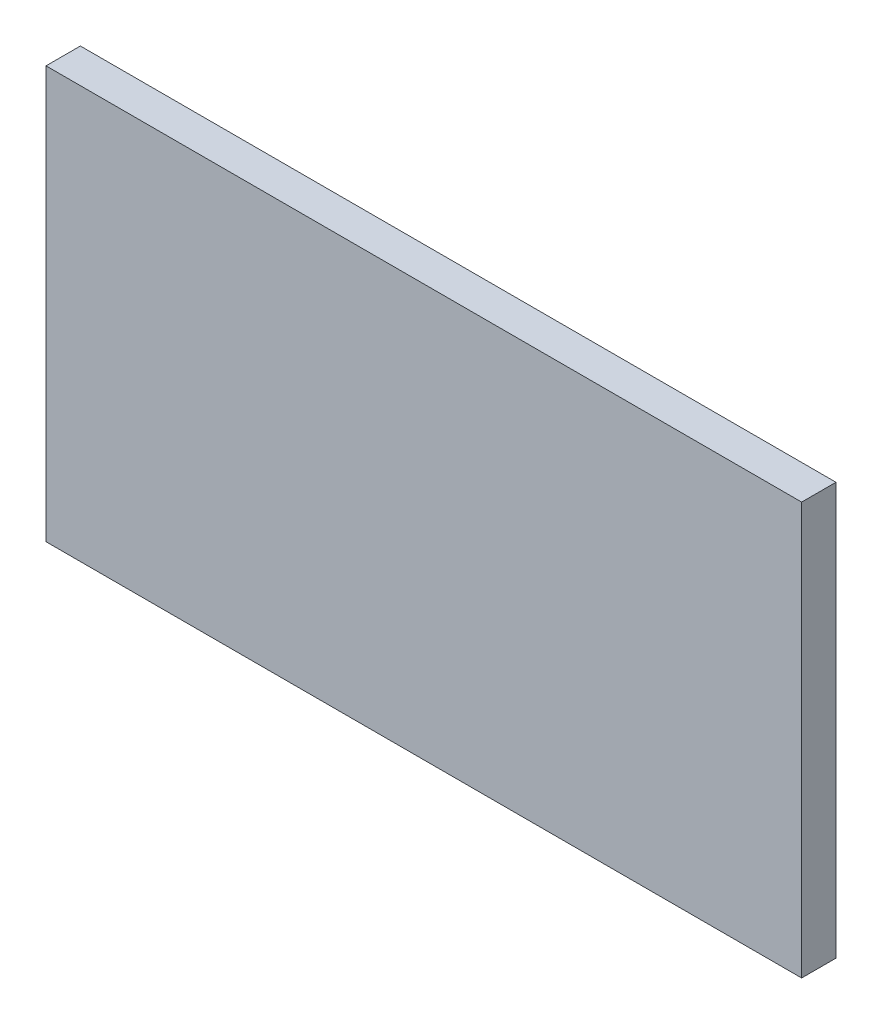
ISO-10303-21;
HEADER;
FILE_DESCRIPTION(('STEP AP214'),'2;1');
FILE_NAME('part.step','',(''),(''),'','','');
FILE_SCHEMA(('AUTOMOTIVE_DESIGN { 1 0 10303 214 1 1 1 1 }'));
ENDSEC;
DATA;
#1=APPLICATION_CONTEXT('core data for automotive mechanical design processes');
#2=APPLICATION_PROTOCOL_DEFINITION('international standard','automotive_design',2000,#1);
#3=PRODUCT_CONTEXT('',#1,'mechanical');
#4=PRODUCT('Part','Part','',(#3));
#5=PRODUCT_RELATED_PRODUCT_CATEGORY('part','',(#4));
#6=PRODUCT_DEFINITION_FORMATION('','',#4);
#7=PRODUCT_DEFINITION_CONTEXT('part definition',#1,'design');
#8=PRODUCT_DEFINITION('design','',#6,#7);
#9=PRODUCT_DEFINITION_SHAPE('','',#8);
#10=(LENGTH_UNIT() NAMED_UNIT(*) SI_UNIT(.MILLI.,.METRE.));
#11=(NAMED_UNIT(*) PLANE_ANGLE_UNIT() SI_UNIT($,.RADIAN.));
#12=(NAMED_UNIT(*) SI_UNIT($,.STERADIAN.) SOLID_ANGLE_UNIT());
#13=UNCERTAINTY_MEASURE_WITH_UNIT(LENGTH_MEASURE(1.E-05),#10,'distance_accuracy_value','');
#14=(GEOMETRIC_REPRESENTATION_CONTEXT(3) GLOBAL_UNCERTAINTY_ASSIGNED_CONTEXT((#13)) GLOBAL_UNIT_ASSIGNED_CONTEXT((#10,
#11,#12)) REPRESENTATION_CONTEXT('',''));
#15=CARTESIAN_POINT('',(0.,0.,0.));
#16=DIRECTION('',(0.,0.,1.));
#17=DIRECTION('',(1.,0.,0.));
#18=AXIS2_PLACEMENT_3D('',#15,#16,#17);
#19=CARTESIAN_POINT('',(55.,30.,5.));
#20=DIRECTION('',(-1.,0.,0.));
#21=DIRECTION('',(0.,-1.,0.));
#22=AXIS2_PLACEMENT_3D('',#19,#20,#21);
#23=PLANE('',#22);
#24=DIRECTION('',(0.,1.,0.));
#25=VECTOR('',#24,1.);
#26=CARTESIAN_POINT('',(55.,30.,0.));
#27=LINE('',#26,#25);
#28=CARTESIAN_POINT('',(55.,-30.,0.));
#29=VERTEX_POINT('',#28);
#30=CARTESIAN_POINT('',(55.,30.,0.));
#31=VERTEX_POINT('',#30);
#32=EDGE_CURVE('E107',#29,#31,#27,.T.);
#33=ORIENTED_EDGE('',*,*,#32,.T.);
#34=DIRECTION('',(0.,0.,-1.));
#35=VECTOR('',#34,1.);
#36=CARTESIAN_POINT('',(55.,30.,5.));
#37=LINE('',#36,#35);
#38=CARTESIAN_POINT('',(55.,30.,5.));
#39=VERTEX_POINT('',#38);
#40=EDGE_CURVE('E11',#39,#31,#37,.T.);
#41=ORIENTED_EDGE('',*,*,#40,.F.);
#42=DIRECTION('',(0.,1.,0.));
#43=VECTOR('',#42,1.);
#44=CARTESIAN_POINT('',(55.,30.,5.));
#45=LINE('',#44,#43);
#46=CARTESIAN_POINT('',(55.,-30.,5.));
#47=VERTEX_POINT('',#46);
#48=EDGE_CURVE('E91',#47,#39,#45,.T.);
#49=ORIENTED_EDGE('',*,*,#48,.F.);
#50=DIRECTION('',(0.,0.,-1.));
#51=VECTOR('',#50,1.);
#52=CARTESIAN_POINT('',(55.,-30.,5.));
#53=LINE('',#52,#51);
#54=EDGE_CURVE('E103',#47,#29,#53,.T.);
#55=ORIENTED_EDGE('',*,*,#54,.T.);
#56=EDGE_LOOP('',(#33,#41,#49,#55));
#57=FACE_BOUND('',#56,.T.);
#58=ADVANCED_FACE('F39',(#57),#23,.F.);
#59=CARTESIAN_POINT('',(-55.,30.,5.));
#60=DIRECTION('',(0.,-1.,0.));
#61=DIRECTION('',(0.,0.,-1.));
#62=AXIS2_PLACEMENT_3D('',#59,#60,#61);
#63=PLANE('',#62);
#64=DIRECTION('',(-1.,0.,0.));
#65=VECTOR('',#64,1.);
#66=CARTESIAN_POINT('',(-55.,30.,0.));
#67=LINE('',#66,#65);
#68=CARTESIAN_POINT('',(-55.,30.,0.));
#69=VERTEX_POINT('',#68);
#70=EDGE_CURVE('E96',#31,#69,#67,.T.);
#71=ORIENTED_EDGE('',*,*,#70,.T.);
#72=DIRECTION('',(0.,0.,-1.));
#73=VECTOR('',#72,1.);
#74=CARTESIAN_POINT('',(-55.,30.,5.));
#75=LINE('',#74,#73);
#76=CARTESIAN_POINT('',(-55.,30.,5.));
#77=VERTEX_POINT('',#76);
#78=EDGE_CURVE('E48',#77,#69,#75,.T.);
#79=ORIENTED_EDGE('',*,*,#78,.F.);
#80=DIRECTION('',(-1.,0.,0.));
#81=VECTOR('',#80,1.);
#82=CARTESIAN_POINT('',(-55.,30.,5.));
#83=LINE('',#82,#81);
#84=EDGE_CURVE('E86',#39,#77,#83,.T.);
#85=ORIENTED_EDGE('',*,*,#84,.F.);
#86=ORIENTED_EDGE('',*,*,#40,.T.);
#87=EDGE_LOOP('',(#71,#79,#85,#86));
#88=FACE_BOUND('',#87,.T.);
#89=ADVANCED_FACE('F95',(#88),#63,.F.);
#90=CARTESIAN_POINT('',(-55.,30.,5.));
#91=DIRECTION('',(1.,0.,0.));
#92=DIRECTION('',(0.,1.,0.));
#93=AXIS2_PLACEMENT_3D('',#90,#91,#92);
#94=PLANE('',#93);
#95=DIRECTION('',(0.,-1.,0.));
#96=VECTOR('',#95,1.);
#97=CARTESIAN_POINT('',(-55.,30.,0.));
#98=LINE('',#97,#96);
#99=CARTESIAN_POINT('',(-55.,-30.,0.));
#100=VERTEX_POINT('',#99);
#101=EDGE_CURVE('E73',#69,#100,#98,.T.);
#102=ORIENTED_EDGE('',*,*,#101,.T.);
#103=DIRECTION('',(0.,0.,-1.));
#104=VECTOR('',#103,1.);
#105=CARTESIAN_POINT('',(-55.,-30.,5.));
#106=LINE('',#105,#104);
#107=CARTESIAN_POINT('',(-55.,-30.,5.));
#108=VERTEX_POINT('',#107);
#109=EDGE_CURVE('E98',#108,#100,#106,.T.);
#110=ORIENTED_EDGE('',*,*,#109,.F.);
#111=DIRECTION('',(0.,-1.,0.));
#112=VECTOR('',#111,1.);
#113=CARTESIAN_POINT('',(-55.,30.,5.));
#114=LINE('',#113,#112);
#115=EDGE_CURVE('E89',#77,#108,#114,.T.);
#116=ORIENTED_EDGE('',*,*,#115,.F.);
#117=ORIENTED_EDGE('',*,*,#78,.T.);
#118=EDGE_LOOP('',(#102,#110,#116,#117));
#119=FACE_BOUND('',#118,.T.);
#120=ADVANCED_FACE('F99',(#119),#94,.F.);
#121=CARTESIAN_POINT('',(-55.,-30.,5.));
#122=DIRECTION('',(0.,1.,0.));
#123=DIRECTION('',(0.,0.,1.));
#124=AXIS2_PLACEMENT_3D('',#121,#122,#123);
#125=PLANE('',#124);
#126=DIRECTION('',(1.,0.,0.));
#127=VECTOR('',#126,1.);
#128=CARTESIAN_POINT('',(-55.,-30.,0.));
#129=LINE('',#128,#127);
#130=EDGE_CURVE('E79',#100,#29,#129,.T.);
#131=ORIENTED_EDGE('',*,*,#130,.T.);
#132=ORIENTED_EDGE('',*,*,#54,.F.);
#133=DIRECTION('',(1.,0.,0.));
#134=VECTOR('',#133,1.);
#135=CARTESIAN_POINT('',(-55.,-30.,5.));
#136=LINE('',#135,#134);
#137=EDGE_CURVE('E56',#108,#47,#136,.T.);
#138=ORIENTED_EDGE('',*,*,#137,.F.);
#139=ORIENTED_EDGE('',*,*,#109,.T.);
#140=EDGE_LOOP('',(#131,#132,#138,#139));
#141=FACE_BOUND('',#140,.T.);
#142=ADVANCED_FACE('F120',(#141),#125,.F.);
#143=CARTESIAN_POINT('',(0.,0.,5.));
#144=DIRECTION('',(0.,0.,1.));
#145=DIRECTION('',(1.,0.,0.));
#146=AXIS2_PLACEMENT_3D('',#143,#144,#145);
#147=PLANE('',#146);
#148=ORIENTED_EDGE('',*,*,#48,.T.);
#149=ORIENTED_EDGE('',*,*,#84,.T.);
#150=ORIENTED_EDGE('',*,*,#115,.T.);
#151=ORIENTED_EDGE('',*,*,#137,.T.);
#152=EDGE_LOOP('',(#148,#149,#150,#151));
#153=FACE_BOUND('',#152,.T.);
#154=ADVANCED_FACE('F87',(#153),#147,.T.);
#155=CARTESIAN_POINT('',(0.,0.,0.));
#156=DIRECTION('',(0.,0.,1.));
#157=DIRECTION('',(1.,0.,0.));
#158=AXIS2_PLACEMENT_3D('',#155,#156,#157);
#159=PLANE('',#158);
#160=ORIENTED_EDGE('',*,*,#32,.F.);
#161=ORIENTED_EDGE('',*,*,#130,.F.);
#162=ORIENTED_EDGE('',*,*,#101,.F.);
#163=ORIENTED_EDGE('',*,*,#70,.F.);
#164=EDGE_LOOP('',(#160,#161,#162,#163));
#165=FACE_BOUND('',#164,.T.);
#166=ADVANCED_FACE('F123',(#165),#159,.F.);
#167=CLOSED_SHELL('',(#58,#89,#120,#142,#154,#166));
#168=MANIFOLD_SOLID_BREP('B2',#167);
#169=ADVANCED_BREP_SHAPE_REPRESENTATION('',(#18,#168),#14);
#170=SHAPE_DEFINITION_REPRESENTATION(#9,#169);
ENDSEC;
END-ISO-10303-21;
